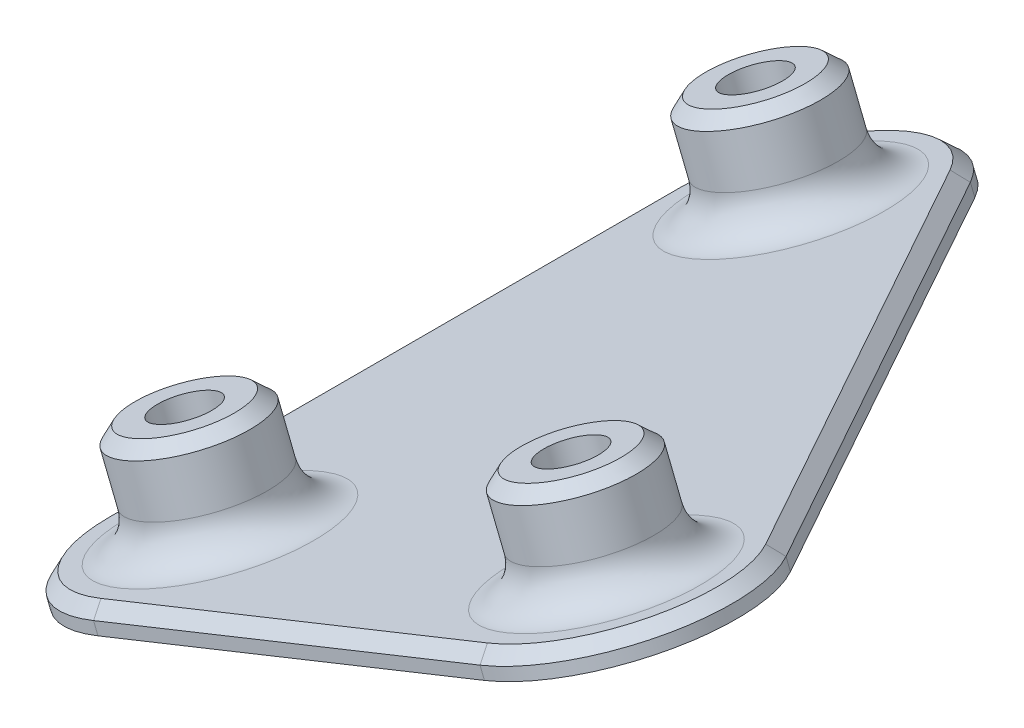
ISO-10303-21;
HEADER;
FILE_DESCRIPTION(('STEP AP214'),'2;1');
FILE_NAME('part.step','',(''),(''),'','','');
FILE_SCHEMA(('AUTOMOTIVE_DESIGN { 1 0 10303 214 1 1 1 1 }'));
ENDSEC;
DATA;
#1=APPLICATION_CONTEXT('core data for automotive mechanical design processes');
#2=APPLICATION_PROTOCOL_DEFINITION('international standard','automotive_design',2000,#1);
#3=PRODUCT_CONTEXT('',#1,'mechanical');
#4=PRODUCT('Part','Part','',(#3));
#5=PRODUCT_RELATED_PRODUCT_CATEGORY('part','',(#4));
#6=PRODUCT_DEFINITION_FORMATION('','',#4);
#7=PRODUCT_DEFINITION_CONTEXT('part definition',#1,'design');
#8=PRODUCT_DEFINITION('design','',#6,#7);
#9=PRODUCT_DEFINITION_SHAPE('','',#8);
#10=(LENGTH_UNIT() NAMED_UNIT(*) SI_UNIT(.MILLI.,.METRE.));
#11=(NAMED_UNIT(*) PLANE_ANGLE_UNIT() SI_UNIT($,.RADIAN.));
#12=(NAMED_UNIT(*) SI_UNIT($,.STERADIAN.) SOLID_ANGLE_UNIT());
#13=UNCERTAINTY_MEASURE_WITH_UNIT(LENGTH_MEASURE(1.E-05),#10,'distance_accuracy_value','');
#14=(GEOMETRIC_REPRESENTATION_CONTEXT(3) GLOBAL_UNCERTAINTY_ASSIGNED_CONTEXT((#13)) GLOBAL_UNIT_ASSIGNED_CONTEXT((#10,
#11,#12)) REPRESENTATION_CONTEXT('',''));
#15=CARTESIAN_POINT('',(0.,0.,0.));
#16=DIRECTION('',(0.,0.,1.));
#17=DIRECTION('',(1.,0.,0.));
#18=AXIS2_PLACEMENT_3D('',#15,#16,#17);
#19=CARTESIAN_POINT('',(1120.06818759234,718.613398960718,26.0999999739497));
#20=DIRECTION('',(0.371486563143886,-0.928438330425637,2.53963516882997E-11));
#21=DIRECTION('',(0.928438330425637,0.371486563143886,0.));
#22=AXIS2_PLACEMENT_3D('',#19,#20,#21);
#23=CONICAL_SURFACE('',#22,3.45850000000014,0.785398162500056);
#24=CARTESIAN_POINT('',(1120.06818759234,718.613398960718,26.0999999739497));
#25=DIRECTION('',(-0.371486563143782,0.928438330425678,-2.53948283085827E-11));
#26=DIRECTION('',(-0.928438330425678,-0.371486563143782,0.));
#27=AXIS2_PLACEMENT_3D('',#24,#25,#26);
#28=CIRCLE('',#27,3.45850000000006);
#29=CARTESIAN_POINT('',(1116.85718362656,717.328612682085,26.0999999739497));
#30=VERTEX_POINT('',#29);
#31=EDGE_CURVE('E196',#30,#30,#28,.T.);
#32=ORIENTED_EDGE('',*,*,#31,.F.);
#33=EDGE_LOOP('',(#32));
#34=FACE_BOUND('',#33,.T.);
#35=CARTESIAN_POINT('',(1119.6967010292,719.541837291144,26.0999999739243));
#36=DIRECTION('',(0.371486563143903,-0.92843833042563,2.53963516882997E-11));
#37=DIRECTION('',(-0.92843833042563,-0.371486563143903,0.));
#38=AXIS2_PLACEMENT_3D('',#35,#36,#37);
#39=CIRCLE('',#38,2.4585);
#40=CARTESIAN_POINT('',(1117.41413539385,718.628537575654,26.0999999739243));
#41=VERTEX_POINT('',#40);
#42=EDGE_CURVE('E28',#41,#41,#39,.T.);
#43=ORIENTED_EDGE('',*,*,#42,.F.);
#44=EDGE_LOOP('',(#43));
#45=FACE_BOUND('',#44,.T.);
#46=ADVANCED_FACE('F17',(#34,#45),#23,.F.);
#47=CARTESIAN_POINT('',(1120.06818759279,718.613398959585,-21.9000000198404));
#48=DIRECTION('',(0.37148656314381,-0.928438330425667,2.53963516882945E-11));
#49=DIRECTION('',(0.928438330425667,0.37148656314381,0.));
#50=AXIS2_PLACEMENT_3D('',#47,#48,#49);
#51=CONICAL_SURFACE('',#50,3.45850000000018,0.785398162499972);
#52=CARTESIAN_POINT('',(1120.06818759279,718.613398959585,-21.9000000198404));
#53=DIRECTION('',(-0.37148656314381,0.928438330425667,-2.53948283085827E-11));
#54=DIRECTION('',(-0.928438330425667,-0.37148656314381,0.));
#55=AXIS2_PLACEMENT_3D('',#52,#53,#54);
#56=CIRCLE('',#55,3.45850000000018);
#57=CARTESIAN_POINT('',(1116.85718362701,717.328612680952,-21.9000000198404));
#58=VERTEX_POINT('',#57);
#59=EDGE_CURVE('E199',#58,#58,#56,.T.);
#60=ORIENTED_EDGE('',*,*,#59,.F.);
#61=EDGE_LOOP('',(#60));
#62=FACE_BOUND('',#61,.T.);
#63=CARTESIAN_POINT('',(1119.69670102965,719.541837290011,-21.9000000198658));
#64=DIRECTION('',(0.371486563143793,-0.928438330425674,2.53963516882945E-11));
#65=DIRECTION('',(-0.928438330425674,-0.371486563143793,0.));
#66=AXIS2_PLACEMENT_3D('',#63,#64,#65);
#67=CIRCLE('',#66,2.4585);
#68=CARTESIAN_POINT('',(1117.4141353943,718.628537574522,-21.9000000198658));
#69=VERTEX_POINT('',#68);
#70=EDGE_CURVE('E11',#69,#69,#67,.T.);
#71=ORIENTED_EDGE('',*,*,#70,.F.);
#72=EDGE_LOOP('',(#71));
#73=FACE_BOUND('',#72,.T.);
#74=ADVANCED_FACE('F360',(#62,#73),#51,.F.);
#75=CARTESIAN_POINT('',(1152.56352915722,731.615428670743,26.0999999739467));
#76=DIRECTION('',(0.371486563143657,-0.928438330425728,2.53963516882992E-11));
#77=DIRECTION('',(0.928438330425728,0.371486563143657,0.));
#78=AXIS2_PLACEMENT_3D('',#75,#76,#77);
#79=CONICAL_SURFACE('',#78,3.45850000000006,0.785398162500003);
#80=CARTESIAN_POINT('',(1152.56352915722,731.615428670743,26.0999999739467));
#81=DIRECTION('',(-0.371486563143793,0.928438330425674,-2.53948283085827E-11));
#82=DIRECTION('',(-0.928438330425674,-0.371486563143793,0.));
#83=AXIS2_PLACEMENT_3D('',#80,#81,#82);
#84=CIRCLE('',#83,3.45850000000067);
#85=CARTESIAN_POINT('',(1149.35252519144,730.33064239211,26.0999999739467));
#86=VERTEX_POINT('',#85);
#87=EDGE_CURVE('E287',#86,#86,#84,.T.);
#88=ORIENTED_EDGE('',*,*,#87,.F.);
#89=EDGE_LOOP('',(#88));
#90=FACE_BOUND('',#89,.T.);
#91=CARTESIAN_POINT('',(1152.19204259408,732.543867001169,26.0999999739213));
#92=DIRECTION('',(0.371486563143678,-0.92843833042572,2.53963516882992E-11));
#93=DIRECTION('',(-0.92843833042572,-0.371486563143678,0.));
#94=AXIS2_PLACEMENT_3D('',#91,#92,#93);
#95=CIRCLE('',#94,2.4585);
#96=CARTESIAN_POINT('',(1149.90947695873,731.63056728568,26.0999999739213));
#97=VERTEX_POINT('',#96);
#98=EDGE_CURVE('E195',#97,#97,#95,.T.);
#99=ORIENTED_EDGE('',*,*,#98,.F.);
#100=EDGE_LOOP('',(#99));
#101=FACE_BOUND('',#100,.T.);
#102=ADVANCED_FACE('F356',(#90,#101),#79,.F.);
#103=CARTESIAN_POINT('',(1120.06818759279,718.613398959586,-21.9000000198404));
#104=DIRECTION('',(-0.371486563143793,0.928438330425674,-2.53948283085827E-11));
#105=DIRECTION('',(-0.928438330425674,-0.371486563143793,0.));
#106=AXIS2_PLACEMENT_3D('',#103,#104,#105);
#107=CYLINDRICAL_SURFACE('',#106,2.4585);
#108=CARTESIAN_POINT('',(1116.35332196135,727.897782263842,-21.9000000200944));
#109=DIRECTION('',(0.371486563143793,-0.928438330425674,2.53912446623872E-11));
#110=DIRECTION('',(0.928438330425674,0.371486563143793,0.));
#111=AXIS2_PLACEMENT_3D('',#108,#109,#110);
#112=CIRCLE('',#111,2.4585);
#113=CARTESIAN_POINT('',(1118.6358875967,728.811081979331,-21.9000000200944));
#114=VERTEX_POINT('',#113);
#115=EDGE_CURVE('E204',#114,#114,#112,.T.);
#116=ORIENTED_EDGE('',*,*,#115,.F.);
#117=EDGE_LOOP('',(#116));
#118=FACE_BOUND('',#117,.T.);
#119=ORIENTED_EDGE('',*,*,#70,.T.);
#120=EDGE_LOOP('',(#119));
#121=FACE_BOUND('',#120,.T.);
#122=ADVANCED_FACE('F359',(#118,#121),#107,.F.);
#123=CARTESIAN_POINT('',(1120.06818759234,718.613398960719,26.0999999739497));
#124=DIRECTION('',(-0.371486563143793,0.928438330425674,-2.53948283085827E-11));
#125=DIRECTION('',(-0.928438330425674,-0.371486563143793,0.));
#126=AXIS2_PLACEMENT_3D('',#123,#124,#125);
#127=CYLINDRICAL_SURFACE('',#126,2.4585);
#128=CARTESIAN_POINT('',(1116.3533219609,727.897782264975,26.0999999736958));
#129=DIRECTION('',(0.371486563143793,-0.928438330425674,2.53912446623872E-11));
#130=DIRECTION('',(0.928438330425674,0.371486563143793,0.));
#131=AXIS2_PLACEMENT_3D('',#128,#129,#130);
#132=CIRCLE('',#131,2.4585);
#133=CARTESIAN_POINT('',(1118.63588759625,728.811081980464,26.0999999736958));
#134=VERTEX_POINT('',#133);
#135=EDGE_CURVE('E244',#134,#134,#132,.T.);
#136=ORIENTED_EDGE('',*,*,#135,.F.);
#137=EDGE_LOOP('',(#136));
#138=FACE_BOUND('',#137,.T.);
#139=ORIENTED_EDGE('',*,*,#42,.T.);
#140=EDGE_LOOP('',(#139));
#141=FACE_BOUND('',#140,.T.);
#142=ADVANCED_FACE('F367',(#138,#141),#127,.F.);
#143=CARTESIAN_POINT('',(1152.56352915722,731.615428670744,26.0999999739467));
#144=DIRECTION('',(-0.371486563143793,0.928438330425674,-2.53948283085827E-11));
#145=DIRECTION('',(-0.928438330425674,-0.371486563143793,0.));
#146=AXIS2_PLACEMENT_3D('',#143,#144,#145);
#147=CYLINDRICAL_SURFACE('',#146,2.4585);
#148=CARTESIAN_POINT('',(1148.84866352578,740.899811975,26.0999999736928));
#149=DIRECTION('',(0.371486563143793,-0.928438330425674,2.53912446623872E-11));
#150=DIRECTION('',(0.928438330425674,0.371486563143793,0.));
#151=AXIS2_PLACEMENT_3D('',#148,#149,#150);
#152=CIRCLE('',#151,2.4585);
#153=CARTESIAN_POINT('',(1151.13122916113,741.813111690489,26.0999999736928));
#154=VERTEX_POINT('',#153);
#155=EDGE_CURVE('E259',#154,#154,#152,.T.);
#156=ORIENTED_EDGE('',*,*,#155,.F.);
#157=EDGE_LOOP('',(#156));
#158=FACE_BOUND('',#157,.T.);
#159=ORIENTED_EDGE('',*,*,#98,.T.);
#160=EDGE_LOOP('',(#159));
#161=FACE_BOUND('',#160,.T.);
#162=ADVANCED_FACE('F364',(#158,#161),#147,.F.);
#163=CARTESIAN_POINT('',(1151.82055603093,733.472305331595,26.099999973896));
#164=DIRECTION('',(0.371486563143733,-0.928438330425698,2.53928822413525E-11));
#165=DIRECTION('',(0.928438330425698,0.371486563143733,0.));
#166=AXIS2_PLACEMENT_3D('',#163,#164,#165);
#167=CONICAL_SURFACE('',#166,10.,0.785398162500082);
#168=DIRECTION('',(0.262680667912137,-0.656505039340775,0.707106781204509));
#169=VECTOR('',#168,1.);
#170=CARTESIAN_POINT('',(1151.82055603084,733.472305331832,36.0999999738959));
#171=LINE('',#170,#169);
#172=CARTESIAN_POINT('',(1151.82055603084,733.472305331832,36.0999999738959));
#173=VERTEX_POINT('',#172);
#174=CARTESIAN_POINT('',(1152.19204259398,732.54386700143,37.0999999739213));
#175=VERTEX_POINT('',#174);
#176=EDGE_CURVE('E203',#173,#175,#171,.T.);
#177=ORIENTED_EDGE('',*,*,#176,.T.);
#178=CARTESIAN_POINT('',(1152.19204259408,732.54386700117,26.0999999739214));
#179=DIRECTION('',(0.371486563143737,-0.928438330425697,2.53928822413525E-11));
#180=DIRECTION('',(-0.928438330425697,-0.371486563143737,0.));
#181=AXIS2_PLACEMENT_3D('',#178,#179,#180);
#182=CIRCLE('',#181,11.);
#183=CARTESIAN_POINT('',(1160.44407937935,735.845670345203,19.6191062414308));
#184=VERTEX_POINT('',#183);
#185=EDGE_CURVE('E179',#184,#175,#182,.T.);
#186=ORIENTED_EDGE('',*,*,#185,.F.);
#187=DIRECTION('',(-0.79314168332465,0.444257081656352,0.416607627835979));
#188=VECTOR('',#187,1.);
#189=CARTESIAN_POINT('',(1160.44407937935,735.845670345203,19.6191062414308));
#190=LINE('',#189,#188);
#191=CARTESIAN_POINT('',(1159.32240765391,736.473944735264,20.2082783989076));
#192=VERTEX_POINT('',#191);
#193=EDGE_CURVE('E200',#184,#192,#190,.T.);
#194=ORIENTED_EDGE('',*,*,#193,.T.);
#195=CARTESIAN_POINT('',(1151.82055603093,733.472305331595,26.099999973896));
#196=DIRECTION('',(-0.371486563143796,0.928438330425673,-2.53948283085827E-11));
#197=DIRECTION('',(-0.928438330425673,-0.371486563143796,0.));
#198=AXIS2_PLACEMENT_3D('',#195,#196,#197);
#199=CIRCLE('',#198,9.99999999999934);
#200=EDGE_CURVE('E292',#173,#192,#199,.T.);
#201=ORIENTED_EDGE('',*,*,#200,.F.);
#202=EDGE_LOOP('',(#177,#186,#194,#201));
#203=FACE_BOUND('',#202,.T.);
#204=ADVANCED_FACE('F366',(#203),#167,.T.);
#205=CARTESIAN_POINT('',(715.32470595463,558.821671170641,-635.636179692111));
#206=DIRECTION('',(0.267780347487312,0.868752997058772,-0.416607627871809));
#207=DIRECTION('',(-0.841214149051265,0.,-0.540702094906203));
#208=AXIS2_PLACEMENT_3D('',#205,#206,#207);
#209=PLANE('',#208);
#210=DIRECTION('',(-0.793141683324445,0.444257081657208,0.416607627835457));
#211=VECTOR('',#210,1.);
#212=CARTESIAN_POINT('',(1127.94873781492,722.843640634048,-28.3808937523558));
#213=LINE('',#212,#211);
#214=CARTESIAN_POINT('',(1127.94873781492,722.843640634044,-28.3808937523558));
#215=VERTEX_POINT('',#214);
#216=CARTESIAN_POINT('',(1126.82706608947,723.471915024106,-27.7917215948792));
#217=VERTEX_POINT('',#216);
#218=EDGE_CURVE('E274',#215,#217,#213,.T.);
#219=ORIENTED_EDGE('',*,*,#218,.T.);
#220=DIRECTION('',(-0.547010014234095,-0.218869539908393,-0.808007530180198));
#221=VECTOR('',#220,1.);
#222=CARTESIAN_POINT('',(1126.82706608947,723.471915024106,-27.7917215948791));
#223=LINE('',#222,#221);
#224=EDGE_CURVE('E326',#192,#217,#223,.T.);
#225=ORIENTED_EDGE('',*,*,#224,.F.);
#226=ORIENTED_EDGE('',*,*,#193,.F.);
#227=DIRECTION('',(0.547010014234095,0.218869539908392,0.808007530180198));
#228=VECTOR('',#227,1.);
#229=CARTESIAN_POINT('',(1160.44407937935,735.845670345203,19.6191062414309));
#230=LINE('',#229,#228);
#231=EDGE_CURVE('E229',#215,#184,#230,.T.);
#232=ORIENTED_EDGE('',*,*,#231,.F.);
#233=EDGE_LOOP('',(#219,#225,#226,#232));
#234=FACE_BOUND('',#233,.T.);
#235=ADVANCED_FACE('F376',(#234),#209,.T.);
#236=CARTESIAN_POINT('',(-94.0224849308874,234.985831500771,36.0999999740085));
#237=DIRECTION('',(-0.262680667925284,0.656505039374213,0.70710678116858));
#238=DIRECTION('',(0.928438330425703,0.37148656314372,0.));
#239=AXIS2_PLACEMENT_3D('',#236,#237,#238);
#240=PLANE('',#239);
#241=DIRECTION('',(0.26268066791213,-0.656505039340914,0.707106781204382));
#242=VECTOR('',#241,1.);
#243=CARTESIAN_POINT('',(1119.32521446596,720.470275621806,36.099999973899));
#244=LINE('',#243,#242);
#245=CARTESIAN_POINT('',(1119.32521446596,720.470275621806,36.099999973899));
#246=VERTEX_POINT('',#245);
#247=CARTESIAN_POINT('',(1119.6967010291,719.541837291404,37.0999999739243));
#248=VERTEX_POINT('',#247);
#249=EDGE_CURVE('E267',#246,#248,#244,.T.);
#250=ORIENTED_EDGE('',*,*,#249,.T.);
#251=DIRECTION('',(-0.928438330425672,-0.371486563143798,0.));
#252=VECTOR('',#251,1.);
#253=CARTESIAN_POINT('',(1119.6967010291,719.541837291404,37.0999999739243));
#254=LINE('',#253,#252);
#255=EDGE_CURVE('E182',#175,#248,#254,.T.);
#256=ORIENTED_EDGE('',*,*,#255,.F.);
#257=ORIENTED_EDGE('',*,*,#176,.F.);
#258=DIRECTION('',(0.928438330425672,0.371486563143798,0.));
#259=VECTOR('',#258,1.);
#260=CARTESIAN_POINT('',(1151.82055603084,733.472305331832,36.0999999738959));
#261=LINE('',#260,#259);
#262=EDGE_CURVE('E214',#246,#173,#261,.T.);
#263=ORIENTED_EDGE('',*,*,#262,.F.);
#264=EDGE_LOOP('',(#250,#256,#257,#263));
#265=FACE_BOUND('',#264,.T.);
#266=ADVANCED_FACE('F448',(#265),#240,.T.);
#267=CARTESIAN_POINT('',(1119.3252144665,720.470275620437,-21.9000000198916));
#268=DIRECTION('',(0.371486563143695,-0.928438330425713,2.53928822413499E-11));
#269=DIRECTION('',(0.928438330425713,0.371486563143695,0.));
#270=AXIS2_PLACEMENT_3D('',#267,#268,#269);
#271=CONICAL_SURFACE('',#270,10.,0.785398162500054);
#272=DIRECTION('',(0.393824371438909,0.919185707276146,-1.80192642328658E-11));
#273=VECTOR('',#272,1.);
#274=CARTESIAN_POINT('',(1109.48387939497,715.455485095429,-21.9000000198652));
#275=LINE('',#274,#273);
#276=CARTESIAN_POINT('',(1109.48387939496,715.45548509543,-21.9000000198652));
#277=VERTEX_POINT('',#276);
#278=CARTESIAN_POINT('',(1110.04083116225,716.755409988998,-21.9000000198907));
#279=VERTEX_POINT('',#278);
#280=EDGE_CURVE('E21',#277,#279,#275,.T.);
#281=ORIENTED_EDGE('',*,*,#280,.T.);
#282=CARTESIAN_POINT('',(1119.3252144665,720.470275620437,-21.9000000198916));
#283=DIRECTION('',(-0.3714865631438,0.928438330425671,-2.53948283085827E-11));
#284=DIRECTION('',(-0.928438330425671,-0.3714865631438,0.));
#285=AXIS2_PLACEMENT_3D('',#282,#283,#284);
#286=CIRCLE('',#285,10.0000000000011);
#287=EDGE_CURVE('E325',#217,#279,#286,.T.);
#288=ORIENTED_EDGE('',*,*,#287,.F.);
#289=ORIENTED_EDGE('',*,*,#218,.F.);
#290=CARTESIAN_POINT('',(1119.69670102965,719.541837290011,-21.9000000198662));
#291=DIRECTION('',(0.371486563143695,-0.928438330425713,2.53928822413499E-11));
#292=DIRECTION('',(-0.928438330425713,-0.371486563143695,0.));
#293=AXIS2_PLACEMENT_3D('',#290,#291,#292);
#294=CIRCLE('',#293,11.);
#295=EDGE_CURVE('E329',#277,#215,#294,.T.);
#296=ORIENTED_EDGE('',*,*,#295,.F.);
#297=EDGE_LOOP('',(#281,#288,#289,#296));
#298=FACE_BOUND('',#297,.T.);
#299=ADVANCED_FACE('F420',(#298),#271,.T.);
#300=CARTESIAN_POINT('',(1119.32521446605,720.47027562157,26.0999999738989));
#301=DIRECTION('',(0.371486563143886,-0.928438330425637,2.53928822413478E-11));
#302=DIRECTION('',(0.928438330425637,0.371486563143886,0.));
#303=AXIS2_PLACEMENT_3D('',#300,#301,#302);
#304=CONICAL_SURFACE('',#303,10.0000000000002,0.785398162499907);
#305=DIRECTION('',(0.393824371438909,0.919185707276146,-1.80192642328658E-11));
#306=VECTOR('',#305,1.);
#307=CARTESIAN_POINT('',(1110.0408311618,716.755409990132,26.0999999738997));
#308=LINE('',#307,#306);
#309=CARTESIAN_POINT('',(1109.48387939452,715.455485096563,26.0999999739252));
#310=VERTEX_POINT('',#309);
#311=CARTESIAN_POINT('',(1110.0408311618,716.755409990132,26.0999999738997));
#312=VERTEX_POINT('',#311);
#313=EDGE_CURVE('E263',#310,#312,#308,.T.);
#314=ORIENTED_EDGE('',*,*,#313,.F.);
#315=CARTESIAN_POINT('',(1119.6967010292,719.541837291144,26.0999999739243));
#316=DIRECTION('',(0.371486563143888,-0.928438330425636,2.53928822413478E-11));
#317=DIRECTION('',(-0.928438330425636,-0.371486563143888,0.));
#318=AXIS2_PLACEMENT_3D('',#315,#316,#317);
#319=CIRCLE('',#318,11.);
#320=EDGE_CURVE('E268',#248,#310,#319,.T.);
#321=ORIENTED_EDGE('',*,*,#320,.F.);
#322=ORIENTED_EDGE('',*,*,#249,.F.);
#323=CARTESIAN_POINT('',(1119.32521446605,720.47027562157,26.0999999738989));
#324=DIRECTION('',(-0.371486563143802,0.92843833042567,-2.53948283085827E-11));
#325=DIRECTION('',(-0.92843833042567,-0.371486563143802,0.));
#326=AXIS2_PLACEMENT_3D('',#323,#324,#325);
#327=CIRCLE('',#326,10.);
#328=EDGE_CURVE('E238',#312,#246,#327,.T.);
#329=ORIENTED_EDGE('',*,*,#328,.F.);
#330=EDGE_LOOP('',(#314,#321,#322,#329));
#331=FACE_BOUND('',#330,.T.);
#332=ADVANCED_FACE('F417',(#331),#304,.T.);
#333=CARTESIAN_POINT('',(1110.04083116204,716.755409989516,-6.5385768890223E-09));
#334=DIRECTION('',(-0.919185707276171,0.393824371438849,-1.78962215779135E-11));
#335=DIRECTION('',(-1.9469647358797E-11,0.,1.));
#336=AXIS2_PLACEMENT_3D('',#333,#334,#335);
#337=PLANE('',#336);
#338=ORIENTED_EDGE('',*,*,#280,.F.);
#339=DIRECTION('',(9.35422479643266E-12,-2.36093866116359E-11,-1.));
#340=VECTOR('',#339,1.);
#341=CARTESIAN_POINT('',(1109.48387939497,715.455485095429,-21.9000000198652));
#342=LINE('',#341,#340);
#343=EDGE_CURVE('E253',#310,#277,#342,.T.);
#344=ORIENTED_EDGE('',*,*,#343,.F.);
#345=ORIENTED_EDGE('',*,*,#313,.T.);
#346=DIRECTION('',(-9.35422479643266E-12,2.36093866116359E-11,1.));
#347=VECTOR('',#346,1.);
#348=CARTESIAN_POINT('',(1110.0408311618,716.755409990132,26.0999999738997));
#349=LINE('',#348,#347);
#350=EDGE_CURVE('E243',#279,#312,#349,.T.);
#351=ORIENTED_EDGE('',*,*,#350,.F.);
#352=EDGE_LOOP('',(#338,#344,#345,#351));
#353=FACE_BOUND('',#352,.T.);
#354=ADVANCED_FACE('F412',(#353),#337,.T.);
#355=CARTESIAN_POINT('',(1149.22015008893,739.971373644575,26.0999999737181));
#356=DIRECTION('',(0.371486563143695,-0.928438330425713,2.53928822413499E-11));
#357=DIRECTION('',(0.928438330425713,0.371486563143695,0.));
#358=AXIS2_PLACEMENT_3D('',#355,#356,#357);
#359=CONICAL_SURFACE('',#358,5.5,0.785398162500026);
#360=CARTESIAN_POINT('',(1149.22015008893,739.971373644576,26.0999999737181));
#361=DIRECTION('',(0.371486563143702,-0.92843833042571,2.53928822413499E-11));
#362=DIRECTION('',(0.92843833042571,0.371486563143702,0.));
#363=AXIS2_PLACEMENT_3D('',#360,#361,#362);
#364=CIRCLE('',#363,5.5);
#365=CARTESIAN_POINT('',(1154.32656090627,742.014549741866,26.0999999737181));
#366=VERTEX_POINT('',#365);
#367=EDGE_CURVE('E216',#366,#366,#364,.T.);
#368=ORIENTED_EDGE('',*,*,#367,.F.);
#369=EDGE_LOOP('',(#368));
#370=FACE_BOUND('',#369,.T.);
#371=CARTESIAN_POINT('',(1148.84866352578,740.899811975001,26.0999999736927));
#372=DIRECTION('',(-0.371486563143797,0.928438330425672,-2.53912446623872E-11));
#373=DIRECTION('',(0.928438330425672,0.371486563143797,0.));
#374=AXIS2_PLACEMENT_3D('',#371,#372,#373);
#375=CIRCLE('',#374,4.5);
#376=CARTESIAN_POINT('',(1153.0266360127,742.571501509148,26.0999999736927));
#377=VERTEX_POINT('',#376);
#378=EDGE_CURVE('E282',#377,#377,#375,.T.);
#379=ORIENTED_EDGE('',*,*,#378,.F.);
#380=EDGE_LOOP('',(#379));
#381=FACE_BOUND('',#380,.T.);
#382=ADVANCED_FACE('F408',(#370,#381),#359,.T.);
#383=CARTESIAN_POINT('',(1116.72480852405,726.96934393455,26.0999999737212));
#384=DIRECTION('',(0.371486563143695,-0.928438330425713,2.53928822413499E-11));
#385=DIRECTION('',(0.928438330425713,0.371486563143695,0.));
#386=AXIS2_PLACEMENT_3D('',#383,#384,#385);
#387=CONICAL_SURFACE('',#386,5.5,0.785398162500026);
#388=CARTESIAN_POINT('',(1116.72480852405,726.96934393455,26.0999999737212));
#389=DIRECTION('',(0.371486563143688,-0.928438330425716,2.53928822413499E-11));
#390=DIRECTION('',(0.928438330425716,0.371486563143688,0.));
#391=AXIS2_PLACEMENT_3D('',#388,#389,#390);
#392=CIRCLE('',#391,5.5);
#393=CARTESIAN_POINT('',(1121.83121934139,729.01252003184,26.0999999737212));
#394=VERTEX_POINT('',#393);
#395=EDGE_CURVE('E236',#394,#394,#392,.T.);
#396=ORIENTED_EDGE('',*,*,#395,.F.);
#397=EDGE_LOOP('',(#396));
#398=FACE_BOUND('',#397,.T.);
#399=CARTESIAN_POINT('',(1116.3533219609,727.897782264976,26.0999999736958));
#400=DIRECTION('',(-0.371486563143797,0.928438330425672,-2.53912446623872E-11));
#401=DIRECTION('',(0.928438330425672,0.371486563143797,0.));
#402=AXIS2_PLACEMENT_3D('',#399,#400,#401);
#403=CIRCLE('',#402,4.5);
#404=CARTESIAN_POINT('',(1120.53129444782,729.569471799123,26.0999999736958));
#405=VERTEX_POINT('',#404);
#406=EDGE_CURVE('E191',#405,#405,#403,.T.);
#407=ORIENTED_EDGE('',*,*,#406,.F.);
#408=EDGE_LOOP('',(#407));
#409=FACE_BOUND('',#408,.T.);
#410=ADVANCED_FACE('F411',(#398,#409),#387,.T.);
#411=CARTESIAN_POINT('',(1116.7248085245,726.969343933417,-21.9000000200687));
#412=DIRECTION('',(0.371486563143695,-0.928438330425713,2.53928822413499E-11));
#413=DIRECTION('',(0.928438330425713,0.371486563143695,0.));
#414=AXIS2_PLACEMENT_3D('',#411,#412,#413);
#415=CONICAL_SURFACE('',#414,5.5,0.785398162500026);
#416=CARTESIAN_POINT('',(1116.7248085245,726.969343933417,-21.9000000200687));
#417=DIRECTION('',(0.371486563143688,-0.928438330425716,2.53928822413499E-11));
#418=DIRECTION('',(0.928438330425716,0.371486563143688,0.));
#419=AXIS2_PLACEMENT_3D('',#416,#417,#418);
#420=CIRCLE('',#419,5.5);
#421=CARTESIAN_POINT('',(1121.83121934184,729.012520030707,-21.9000000200687));
#422=VERTEX_POINT('',#421);
#423=EDGE_CURVE('E223',#422,#422,#420,.T.);
#424=ORIENTED_EDGE('',*,*,#423,.F.);
#425=EDGE_LOOP('',(#424));
#426=FACE_BOUND('',#425,.T.);
#427=CARTESIAN_POINT('',(1116.35332196135,727.897782263843,-21.9000000200941));
#428=DIRECTION('',(-0.371486563143797,0.928438330425672,-2.53912446623872E-11));
#429=DIRECTION('',(0.928438330425672,0.371486563143797,0.));
#430=AXIS2_PLACEMENT_3D('',#427,#428,#429);
#431=CIRCLE('',#430,4.5);
#432=CARTESIAN_POINT('',(1120.53129444827,729.56947179799,-21.9000000200941));
#433=VERTEX_POINT('',#432);
#434=EDGE_CURVE('E208',#433,#433,#431,.T.);
#435=ORIENTED_EDGE('',*,*,#434,.F.);
#436=EDGE_LOOP('',(#435));
#437=FACE_BOUND('',#436,.T.);
#438=ADVANCED_FACE('F424',(#426,#437),#415,.T.);
#439=CARTESIAN_POINT('',(1150.7060963415,736.257620322872,26.0999999738197));
#440=DIRECTION('',(-0.371486563143798,0.928438330425672,-2.53948283085827E-11));
#441=DIRECTION('',(-0.928438330425672,-0.371486563143798,0.));
#442=AXIS2_PLACEMENT_3D('',#439,#440,#441);
#443=TOROIDAL_SURFACE('',#442,8.5,3.);
#444=CARTESIAN_POINT('',(1150.7060963415,736.257620322872,26.0999999738197));
#445=DIRECTION('',(-0.371486563143803,0.92843833042567,-2.53948283085827E-11));
#446=DIRECTION('',(-0.92843833042567,-0.371486563143803,0.));
#447=AXIS2_PLACEMENT_3D('',#444,#445,#446);
#448=CIRCLE('',#447,5.5);
#449=CARTESIAN_POINT('',(1145.59968552416,734.214444225582,26.0999999738197));
#450=VERTEX_POINT('',#449);
#451=EDGE_CURVE('E220',#450,#450,#448,.T.);
#452=ORIENTED_EDGE('',*,*,#451,.F.);
#453=EDGE_LOOP('',(#452));
#454=FACE_BOUND('',#453,.T.);
#455=CARTESIAN_POINT('',(1151.82055603093,733.472305331595,26.0999999738959));
#456=DIRECTION('',(0.371486563143794,-0.928438330425673,2.53948283085827E-11));
#457=DIRECTION('',(-0.928438330425673,-0.371486563143794,0.));
#458=AXIS2_PLACEMENT_3D('',#455,#456,#457);
#459=CIRCLE('',#458,8.5);
#460=CARTESIAN_POINT('',(1143.92883022232,730.314669544873,26.0999999738959));
#461=VERTEX_POINT('',#460);
#462=EDGE_CURVE('E283',#461,#461,#459,.T.);
#463=ORIENTED_EDGE('',*,*,#462,.F.);
#464=EDGE_LOOP('',(#463));
#465=FACE_BOUND('',#464,.T.);
#466=ADVANCED_FACE('F457',(#454,#465),#443,.F.);
#467=CARTESIAN_POINT('',(1118.21075477662,723.255590612847,26.0999999738228));
#468=DIRECTION('',(-0.371486563143798,0.928438330425672,-2.53948283085827E-11));
#469=DIRECTION('',(-0.928438330425672,-0.371486563143798,0.));
#470=AXIS2_PLACEMENT_3D('',#467,#468,#469);
#471=TOROIDAL_SURFACE('',#470,8.5,3.);
#472=CARTESIAN_POINT('',(1118.21075477662,723.255590612847,26.0999999738228));
#473=DIRECTION('',(-0.371486563143803,0.92843833042567,-2.53948283085827E-11));
#474=DIRECTION('',(-0.92843833042567,-0.371486563143803,0.));
#475=AXIS2_PLACEMENT_3D('',#472,#473,#474);
#476=CIRCLE('',#475,5.5);
#477=CARTESIAN_POINT('',(1113.10434395928,721.212414515556,26.0999999738228));
#478=VERTEX_POINT('',#477);
#479=EDGE_CURVE('E248',#478,#478,#476,.T.);
#480=ORIENTED_EDGE('',*,*,#479,.F.);
#481=EDGE_LOOP('',(#480));
#482=FACE_BOUND('',#481,.T.);
#483=CARTESIAN_POINT('',(1119.32521446606,720.47027562157,26.099999973899));
#484=DIRECTION('',(0.371486563143794,-0.928438330425673,2.53948283085827E-11));
#485=DIRECTION('',(-0.928438330425673,-0.371486563143794,0.));
#486=AXIS2_PLACEMENT_3D('',#483,#484,#485);
#487=CIRCLE('',#486,8.5);
#488=CARTESIAN_POINT('',(1111.43348865744,717.312639834848,26.099999973899));
#489=VERTEX_POINT('',#488);
#490=EDGE_CURVE('E288',#489,#489,#487,.T.);
#491=ORIENTED_EDGE('',*,*,#490,.F.);
#492=EDGE_LOOP('',(#491));
#493=FACE_BOUND('',#492,.T.);
#494=ADVANCED_FACE('F396',(#482,#493),#471,.F.);
#495=CARTESIAN_POINT('',(1118.21075477707,723.255590611714,-21.9000000199671));
#496=DIRECTION('',(-0.371486563143798,0.928438330425672,-2.53948283085827E-11));
#497=DIRECTION('',(-0.928438330425672,-0.371486563143798,0.));
#498=AXIS2_PLACEMENT_3D('',#495,#496,#497);
#499=TOROIDAL_SURFACE('',#498,8.5,3.);
#500=CARTESIAN_POINT('',(1118.21075477707,723.255590611714,-21.9000000199671));
#501=DIRECTION('',(-0.371486563143803,0.92843833042567,-2.53948283085827E-11));
#502=DIRECTION('',(-0.92843833042567,-0.371486563143803,0.));
#503=AXIS2_PLACEMENT_3D('',#500,#501,#502);
#504=CIRCLE('',#503,5.5);
#505=CARTESIAN_POINT('',(1113.10434395973,721.212414514423,-21.9000000199671));
#506=VERTEX_POINT('',#505);
#507=EDGE_CURVE('E209',#506,#506,#504,.T.);
#508=ORIENTED_EDGE('',*,*,#507,.F.);
#509=EDGE_LOOP('',(#508));
#510=FACE_BOUND('',#509,.T.);
#511=CARTESIAN_POINT('',(1119.3252144665,720.470275620437,-21.9000000198909));
#512=DIRECTION('',(0.371486563143794,-0.928438330425673,2.53948283085827E-11));
#513=DIRECTION('',(-0.928438330425673,-0.371486563143794,0.));
#514=AXIS2_PLACEMENT_3D('',#511,#512,#513);
#515=CIRCLE('',#514,8.5);
#516=CARTESIAN_POINT('',(1111.43348865789,717.312639833715,-21.9000000198909));
#517=VERTEX_POINT('',#516);
#518=EDGE_CURVE('E242',#517,#517,#515,.T.);
#519=ORIENTED_EDGE('',*,*,#518,.F.);
#520=EDGE_LOOP('',(#519));
#521=FACE_BOUND('',#520,.T.);
#522=ADVANCED_FACE('F439',(#510,#521),#499,.F.);
#523=CARTESIAN_POINT('',(1119.32521446605,720.47027562157,26.0999999738989));
#524=DIRECTION('',(0.371486563143796,-0.928438330425673,2.53912165620599E-11));
#525=DIRECTION('',(0.928438330425673,0.371486563143796,0.));
#526=AXIS2_PLACEMENT_3D('',#523,#524,#525);
#527=CYLINDRICAL_SURFACE('',#526,11.);
#528=DIRECTION('',(0.371486563143796,-0.928438330425673,2.53912165620599E-11));
#529=VECTOR('',#528,1.);
#530=CARTESIAN_POINT('',(1119.32521446595,720.47027562183,37.0999999738989));
#531=LINE('',#530,#529);
#532=CARTESIAN_POINT('',(1120.06818759224,718.613398960978,37.0999999739497));
#533=VERTEX_POINT('',#532);
#534=EDGE_CURVE('E172',#248,#533,#531,.T.);
#535=ORIENTED_EDGE('',*,*,#534,.F.);
#536=ORIENTED_EDGE('',*,*,#320,.T.);
#537=DIRECTION('',(-0.371486563143796,0.928438330425673,-2.53912165620599E-11));
#538=VECTOR('',#537,1.);
#539=CARTESIAN_POINT('',(1109.11239283137,716.383923426988,26.0999999738998));
#540=LINE('',#539,#538);
#541=CARTESIAN_POINT('',(1109.85536595766,714.527046766137,26.0999999739506));
#542=VERTEX_POINT('',#541);
#543=EDGE_CURVE('E249',#542,#310,#540,.T.);
#544=ORIENTED_EDGE('',*,*,#543,.F.);
#545=CARTESIAN_POINT('',(1120.06818759234,718.613398960719,26.0999999739497));
#546=DIRECTION('',(0.371486563143796,-0.928438330425673,2.53948283085827E-11));
#547=DIRECTION('',(-0.928438330425673,-0.371486563143796,0.));
#548=AXIS2_PLACEMENT_3D('',#545,#546,#547);
#549=CIRCLE('',#548,11.);
#550=EDGE_CURVE('E163',#533,#542,#549,.T.);
#551=ORIENTED_EDGE('',*,*,#550,.F.);
#552=EDGE_LOOP('',(#535,#536,#544,#551));
#553=FACE_BOUND('',#552,.T.);
#554=ADVANCED_FACE('F434',(#553),#527,.T.);
#555=CARTESIAN_POINT('',(1151.82055603093,733.472305331595,26.099999973896));
#556=DIRECTION('',(0.371486563143796,-0.928438330425673,2.53912165620599E-11));
#557=DIRECTION('',(0.928438330425673,0.371486563143796,0.));
#558=AXIS2_PLACEMENT_3D('',#555,#556,#557);
#559=CYLINDRICAL_SURFACE('',#558,11.);
#560=DIRECTION('',(0.371486563143796,-0.928438330425673,2.53911592803527E-11));
#561=VECTOR('',#560,1.);
#562=CARTESIAN_POINT('',(1160.07259281621,736.774108675633,19.6191062414055));
#563=LINE('',#562,#561);
#564=CARTESIAN_POINT('',(1160.81556594249,734.917232014782,19.6191062414563));
#565=VERTEX_POINT('',#564);
#566=EDGE_CURVE('E233',#184,#565,#563,.T.);
#567=ORIENTED_EDGE('',*,*,#566,.F.);
#568=ORIENTED_EDGE('',*,*,#185,.T.);
#569=DIRECTION('',(-0.371486563143796,0.928438330425673,-2.53912165620599E-11));
#570=VECTOR('',#569,1.);
#571=CARTESIAN_POINT('',(1151.82055603083,733.472305331855,37.099999973896));
#572=LINE('',#571,#570);
#573=CARTESIAN_POINT('',(1152.56352915712,731.615428671004,37.0999999739467));
#574=VERTEX_POINT('',#573);
#575=EDGE_CURVE('E170',#574,#175,#572,.T.);
#576=ORIENTED_EDGE('',*,*,#575,.F.);
#577=CARTESIAN_POINT('',(1152.56352915722,731.615428670744,26.0999999739467));
#578=DIRECTION('',(0.371486563143796,-0.928438330425673,2.53948283085827E-11));
#579=DIRECTION('',(-0.928438330425673,-0.371486563143796,0.));
#580=AXIS2_PLACEMENT_3D('',#577,#578,#579);
#581=CIRCLE('',#580,11.);
#582=EDGE_CURVE('E148',#565,#574,#581,.T.);
#583=ORIENTED_EDGE('',*,*,#582,.F.);
#584=EDGE_LOOP('',(#567,#568,#576,#583));
#585=FACE_BOUND('',#584,.T.);
#586=ADVANCED_FACE('F177',(#585),#559,.T.);
#587=CARTESIAN_POINT('',(1119.3252144665,720.470275620437,-21.9000000198916));
#588=DIRECTION('',(0.371486563143796,-0.928438330425673,2.53912290148612E-11));
#589=DIRECTION('',(0.928438330425673,0.371486563143796,0.));
#590=AXIS2_PLACEMENT_3D('',#587,#588,#589);
#591=CYLINDRICAL_SURFACE('',#590,11.);
#592=DIRECTION('',(0.371486563143796,-0.928438330425673,2.53912290148612E-11));
#593=VECTOR('',#592,1.);
#594=CARTESIAN_POINT('',(1109.11239283182,716.383923425855,-21.9000000198906));
#595=LINE('',#594,#593);
#596=CARTESIAN_POINT('',(1109.85536595811,714.527046765004,-21.9000000198398));
#597=VERTEX_POINT('',#596);
#598=EDGE_CURVE('E215',#277,#597,#595,.T.);
#599=ORIENTED_EDGE('',*,*,#598,.F.);
#600=ORIENTED_EDGE('',*,*,#295,.T.);
#601=DIRECTION('',(-0.371486563143796,0.928438330425673,-2.53912328507099E-11));
#602=VECTOR('',#601,1.);
#603=CARTESIAN_POINT('',(1127.57725125178,723.772078964475,-28.3808937523812));
#604=LINE('',#603,#602);
#605=CARTESIAN_POINT('',(1128.32022437806,721.915202303623,-28.3808937523304));
#606=VERTEX_POINT('',#605);
#607=EDGE_CURVE('E174',#606,#215,#604,.T.);
#608=ORIENTED_EDGE('',*,*,#607,.F.);
#609=CARTESIAN_POINT('',(1120.06818759279,718.613398959585,-21.9000000198408));
#610=DIRECTION('',(0.371486563143796,-0.928438330425673,2.53948283085827E-11));
#611=DIRECTION('',(-0.928438330425673,-0.371486563143796,0.));
#612=AXIS2_PLACEMENT_3D('',#609,#610,#611);
#613=CIRCLE('',#612,11.);
#614=EDGE_CURVE('E164',#597,#606,#613,.T.);
#615=ORIENTED_EDGE('',*,*,#614,.F.);
#616=EDGE_LOOP('',(#599,#600,#608,#615));
#617=FACE_BOUND('',#616,.T.);
#618=ADVANCED_FACE('F404',(#617),#591,.T.);
#619=CARTESIAN_POINT('',(1148.84866352578,740.899811975001,26.0999999736927));
#620=DIRECTION('',(0.371486563143796,-0.928438330425673,2.53912446623872E-11));
#621=DIRECTION('',(0.,-2.73483373427137E-11,-1.));
#622=AXIS2_PLACEMENT_3D('',#619,#620,#621);
#623=PLANE('',#622);
#624=ORIENTED_EDGE('',*,*,#378,.T.);
#625=EDGE_LOOP('',(#624));
#626=FACE_BOUND('',#625,.T.);
#627=ORIENTED_EDGE('',*,*,#155,.T.);
#628=EDGE_LOOP('',(#627));
#629=FACE_BOUND('',#628,.T.);
#630=ADVANCED_FACE('F407',(#626,#629),#623,.F.);
#631=CARTESIAN_POINT('',(1148.84866352578,740.899811975001,26.0999999736927));
#632=DIRECTION('',(0.371486563143803,-0.92843833042567,2.53912165620599E-11));
#633=DIRECTION('',(0.92843833042567,0.371486563143803,0.));
#634=AXIS2_PLACEMENT_3D('',#631,#632,#633);
#635=CYLINDRICAL_SURFACE('',#634,5.5);
#636=ORIENTED_EDGE('',*,*,#451,.T.);
#637=EDGE_LOOP('',(#636));
#638=FACE_BOUND('',#637,.T.);
#639=ORIENTED_EDGE('',*,*,#367,.T.);
#640=EDGE_LOOP('',(#639));
#641=FACE_BOUND('',#640,.T.);
#642=ADVANCED_FACE('F416',(#638,#641),#635,.T.);
#643=CARTESIAN_POINT('',(1116.3533219609,727.897782264976,26.0999999736958));
#644=DIRECTION('',(0.371486563143796,-0.928438330425673,2.53912446623872E-11));
#645=DIRECTION('',(0.,-2.73483373427137E-11,-1.));
#646=AXIS2_PLACEMENT_3D('',#643,#644,#645);
#647=PLANE('',#646);
#648=ORIENTED_EDGE('',*,*,#406,.T.);
#649=EDGE_LOOP('',(#648));
#650=FACE_BOUND('',#649,.T.);
#651=ORIENTED_EDGE('',*,*,#135,.T.);
#652=EDGE_LOOP('',(#651));
#653=FACE_BOUND('',#652,.T.);
#654=ADVANCED_FACE('F19',(#650,#653),#647,.F.);
#655=CARTESIAN_POINT('',(1116.3533219609,727.897782264976,26.0999999736958));
#656=DIRECTION('',(0.371486563143803,-0.92843833042567,2.53912165620599E-11));
#657=DIRECTION('',(0.92843833042567,0.371486563143803,0.));
#658=AXIS2_PLACEMENT_3D('',#655,#656,#657);
#659=CYLINDRICAL_SURFACE('',#658,5.5);
#660=ORIENTED_EDGE('',*,*,#479,.T.);
#661=EDGE_LOOP('',(#660));
#662=FACE_BOUND('',#661,.T.);
#663=ORIENTED_EDGE('',*,*,#395,.T.);
#664=EDGE_LOOP('',(#663));
#665=FACE_BOUND('',#664,.T.);
#666=ADVANCED_FACE('F426',(#662,#665),#659,.T.);
#667=CARTESIAN_POINT('',(1116.35332196135,727.897782263843,-21.9000000200941));
#668=DIRECTION('',(0.371486563143796,-0.928438330425673,2.53912446623872E-11));
#669=DIRECTION('',(0.,-2.73483373427137E-11,-1.));
#670=AXIS2_PLACEMENT_3D('',#667,#668,#669);
#671=PLANE('',#670);
#672=ORIENTED_EDGE('',*,*,#434,.T.);
#673=EDGE_LOOP('',(#672));
#674=FACE_BOUND('',#673,.T.);
#675=ORIENTED_EDGE('',*,*,#115,.T.);
#676=EDGE_LOOP('',(#675));
#677=FACE_BOUND('',#676,.T.);
#678=ADVANCED_FACE('F429',(#674,#677),#671,.F.);
#679=CARTESIAN_POINT('',(1116.35332196135,727.897782263843,-21.9000000200941));
#680=DIRECTION('',(0.371486563143803,-0.92843833042567,2.53912165620599E-11));
#681=DIRECTION('',(0.92843833042567,0.371486563143803,0.));
#682=AXIS2_PLACEMENT_3D('',#679,#680,#681);
#683=CYLINDRICAL_SURFACE('',#682,5.5);
#684=ORIENTED_EDGE('',*,*,#507,.T.);
#685=EDGE_LOOP('',(#684));
#686=FACE_BOUND('',#685,.T.);
#687=ORIENTED_EDGE('',*,*,#423,.T.);
#688=EDGE_LOOP('',(#687));
#689=FACE_BOUND('',#688,.T.);
#690=ADVANCED_FACE('F432',(#686,#689),#683,.T.);
#691=CARTESIAN_POINT('',(-93.2795118042621,233.128954839068,-6.3765891474807E-09));
#692=DIRECTION('',(-0.371486563143798,0.928438330425672,-2.53948283085827E-11));
#693=DIRECTION('',(-6.83600184450081E-11,0.,1.));
#694=AXIS2_PLACEMENT_3D('',#691,#692,#693);
#695=PLANE('',#694);
#696=DIRECTION('',(-9.35280165373616E-12,2.36058298201925E-11,1.));
#697=VECTOR('',#696,1.);
#698=CARTESIAN_POINT('',(1109.85536595842,714.527046764207,-55.6559787755342));
#699=LINE('',#698,#697);
#700=EDGE_CURVE('E210',#597,#542,#699,.T.);
#701=ORIENTED_EDGE('',*,*,#700,.F.);
#702=ORIENTED_EDGE('',*,*,#614,.T.);
#703=DIRECTION('',(-0.547010014234096,-0.218869539908388,-0.808007530180198));
#704=VECTOR('',#703,1.);
#705=CARTESIAN_POINT('',(1162.77635079194,735.701780865241,22.5154497857926));
#706=LINE('',#705,#704);
#707=EDGE_CURVE('E157',#565,#606,#706,.T.);
#708=ORIENTED_EDGE('',*,*,#707,.F.);
#709=ORIENTED_EDGE('',*,*,#582,.T.);
#710=DIRECTION('',(0.928438330425672,0.371486563143798,0.));
#711=VECTOR('',#710,1.);
#712=CARTESIAN_POINT('',(1109.85536595756,714.527046766397,37.0999999739506));
#713=LINE('',#712,#711);
#714=EDGE_CURVE('E154',#533,#574,#713,.T.);
#715=ORIENTED_EDGE('',*,*,#714,.F.);
#716=ORIENTED_EDGE('',*,*,#550,.T.);
#717=EDGE_LOOP('',(#701,#702,#708,#709,#715,#716));
#718=FACE_BOUND('',#717,.T.);
#719=ORIENTED_EDGE('',*,*,#31,.T.);
#720=EDGE_LOOP('',(#719));
#721=FACE_BOUND('',#720,.T.);
#722=ORIENTED_EDGE('',*,*,#59,.T.);
#723=EDGE_LOOP('',(#722));
#724=FACE_BOUND('',#723,.T.);
#725=ORIENTED_EDGE('',*,*,#87,.T.);
#726=EDGE_LOOP('',(#725));
#727=FACE_BOUND('',#726,.T.);
#728=ADVANCED_FACE('F151',(#718,#721,#724,#727),#695,.F.);
#729=CARTESIAN_POINT('',(-94.0224849305496,234.985831499919,-6.42737158060482E-09));
#730=DIRECTION('',(-0.371486563143798,0.928438330425672,-2.53948283085827E-11));
#731=DIRECTION('',(-6.83600184450081E-11,0.,1.));
#732=AXIS2_PLACEMENT_3D('',#729,#730,#731);
#733=PLANE('',#732);
#734=ORIENTED_EDGE('',*,*,#462,.T.);
#735=EDGE_LOOP('',(#734));
#736=FACE_BOUND('',#735,.T.);
#737=ORIENTED_EDGE('',*,*,#490,.T.);
#738=EDGE_LOOP('',(#737));
#739=FACE_BOUND('',#738,.T.);
#740=ORIENTED_EDGE('',*,*,#518,.T.);
#741=EDGE_LOOP('',(#740));
#742=FACE_BOUND('',#741,.T.);
#743=ORIENTED_EDGE('',*,*,#262,.T.);
#744=ORIENTED_EDGE('',*,*,#200,.T.);
#745=ORIENTED_EDGE('',*,*,#224,.T.);
#746=ORIENTED_EDGE('',*,*,#287,.T.);
#747=ORIENTED_EDGE('',*,*,#350,.T.);
#748=ORIENTED_EDGE('',*,*,#328,.T.);
#749=EDGE_LOOP('',(#743,#744,#745,#746,#747,#748));
#750=FACE_BOUND('',#749,.T.);
#751=ADVANCED_FACE('F402',(#736,#739,#742,#750),#733,.T.);
#752=CARTESIAN_POINT('',(1109.11239283214,716.383923425058,-55.655978775585));
#753=DIRECTION('',(0.928438330425673,0.371486563143796,0.));
#754=DIRECTION('',(0.,-2.3082675491064E-13,-1.));
#755=AXIS2_PLACEMENT_3D('',#752,#753,#754);
#756=PLANE('',#755);
#757=ORIENTED_EDGE('',*,*,#543,.T.);
#758=ORIENTED_EDGE('',*,*,#343,.T.);
#759=ORIENTED_EDGE('',*,*,#598,.T.);
#760=ORIENTED_EDGE('',*,*,#700,.T.);
#761=EDGE_LOOP('',(#757,#758,#759,#760));
#762=FACE_BOUND('',#761,.T.);
#763=ADVANCED_FACE('F398',(#762),#756,.F.);
#764=CARTESIAN_POINT('',(1162.03337766565,737.558657526093,22.5154497857418));
#765=DIRECTION('',(-0.750185162297432,-0.30016394036706,0.589172157499059));
#766=DIRECTION('',(-0.371486563126607,0.92843833043255,0.));
#767=AXIS2_PLACEMENT_3D('',#764,#765,#766);
#768=PLANE('',#767);
#769=ORIENTED_EDGE('',*,*,#607,.T.);
#770=ORIENTED_EDGE('',*,*,#231,.T.);
#771=ORIENTED_EDGE('',*,*,#566,.T.);
#772=ORIENTED_EDGE('',*,*,#707,.T.);
#773=EDGE_LOOP('',(#769,#770,#771,#772));
#774=FACE_BOUND('',#773,.T.);
#775=ADVANCED_FACE('F401',(#774),#768,.F.);
#776=CARTESIAN_POINT('',(1109.11239283127,716.383923427248,37.0999999738998));
#777=DIRECTION('',(9.35462263671423E-12,-2.36053372970842E-11,-1.));
#778=DIRECTION('',(0.,-1.,2.36053372970842E-11));
#779=AXIS2_PLACEMENT_3D('',#776,#777,#778);
#780=PLANE('',#779);
#781=ORIENTED_EDGE('',*,*,#575,.T.);
#782=ORIENTED_EDGE('',*,*,#255,.T.);
#783=ORIENTED_EDGE('',*,*,#534,.T.);
#784=ORIENTED_EDGE('',*,*,#714,.T.);
#785=EDGE_LOOP('',(#781,#782,#783,#784));
#786=FACE_BOUND('',#785,.T.);
#787=ADVANCED_FACE('F168',(#786),#780,.F.);
#788=CLOSED_SHELL('',(#46,#74,#102,#122,#142,#162,#204,#235,#266,#299,#332,#354,#382,#410,#438,
#466,#494,#522,#554,#586,#618,#630,#642,#654,#666,#678,#690,#728,#751,#763,#775,#787));
#789=MANIFOLD_SOLID_BREP('B1',#788);
#790=ADVANCED_BREP_SHAPE_REPRESENTATION('',(#18,#789),#14);
#791=SHAPE_DEFINITION_REPRESENTATION(#9,#790);
ENDSEC;
END-ISO-10303-21;
